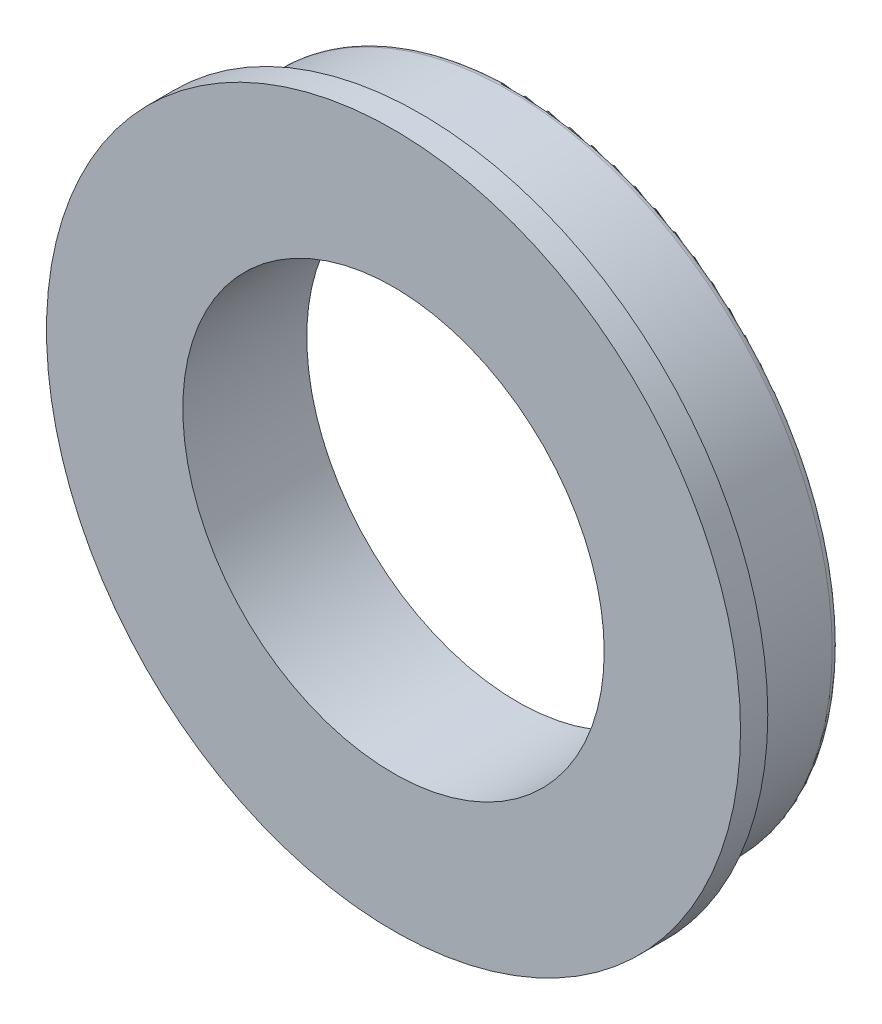
ISO-10303-21;
HEADER;
FILE_DESCRIPTION(('STEP AP214'),'2;1');
FILE_NAME('part.step','',(''),(''),'','','');
FILE_SCHEMA(('AUTOMOTIVE_DESIGN { 1 0 10303 214 1 1 1 1 }'));
ENDSEC;
DATA;
#1=APPLICATION_CONTEXT('core data for automotive mechanical design processes');
#2=APPLICATION_PROTOCOL_DEFINITION('international standard','automotive_design',2000,#1);
#3=PRODUCT_CONTEXT('',#1,'mechanical');
#4=PRODUCT('Part','Part','',(#3));
#5=PRODUCT_RELATED_PRODUCT_CATEGORY('part','',(#4));
#6=PRODUCT_DEFINITION_FORMATION('','',#4);
#7=PRODUCT_DEFINITION_CONTEXT('part definition',#1,'design');
#8=PRODUCT_DEFINITION('design','',#6,#7);
#9=PRODUCT_DEFINITION_SHAPE('','',#8);
#10=(LENGTH_UNIT() NAMED_UNIT(*) SI_UNIT(.MILLI.,.METRE.));
#11=(NAMED_UNIT(*) PLANE_ANGLE_UNIT() SI_UNIT($,.RADIAN.));
#12=(NAMED_UNIT(*) SI_UNIT($,.STERADIAN.) SOLID_ANGLE_UNIT());
#13=UNCERTAINTY_MEASURE_WITH_UNIT(LENGTH_MEASURE(1.E-05),#10,'distance_accuracy_value','');
#14=(GEOMETRIC_REPRESENTATION_CONTEXT(3) GLOBAL_UNCERTAINTY_ASSIGNED_CONTEXT((#13)) GLOBAL_UNIT_ASSIGNED_CONTEXT((#10,
#11,#12)) REPRESENTATION_CONTEXT('',''));
#15=CARTESIAN_POINT('',(0.,0.,0.));
#16=DIRECTION('',(0.,0.,1.));
#17=DIRECTION('',(1.,0.,0.));
#18=AXIS2_PLACEMENT_3D('',#15,#16,#17);
#19=CARTESIAN_POINT('',(0.,0.,5.));
#20=DIRECTION('',(0.,0.,-1.));
#21=DIRECTION('',(-1.,0.,0.));
#22=AXIS2_PLACEMENT_3D('',#19,#20,#21);
#23=CYLINDRICAL_SURFACE('',#22,13.);
#24=CARTESIAN_POINT('',(0.,0.,0.3));
#25=DIRECTION('',(0.,0.,1.));
#26=DIRECTION('',(1.,0.,0.));
#27=AXIS2_PLACEMENT_3D('',#24,#25,#26);
#28=CIRCLE('',#27,13.);
#29=CARTESIAN_POINT('',(13.,0.,0.3));
#30=VERTEX_POINT('',#29);
#31=EDGE_CURVE('E39',#30,#30,#28,.T.);
#32=ORIENTED_EDGE('',*,*,#31,.T.);
#33=EDGE_LOOP('',(#32));
#34=FACE_BOUND('',#33,.T.);
#35=CARTESIAN_POINT('',(0.,0.,3.9));
#36=DIRECTION('',(0.,0.,1.));
#37=DIRECTION('',(1.,0.,0.));
#38=AXIS2_PLACEMENT_3D('',#35,#36,#37);
#39=CIRCLE('',#38,13.);
#40=CARTESIAN_POINT('',(13.,0.,3.9));
#41=VERTEX_POINT('',#40);
#42=EDGE_CURVE('E43',#41,#41,#39,.T.);
#43=ORIENTED_EDGE('',*,*,#42,.F.);
#44=EDGE_LOOP('',(#43));
#45=FACE_BOUND('',#44,.T.);
#46=ADVANCED_FACE('F32',(#34,#45),#23,.T.);
#47=CARTESIAN_POINT('',(0.,0.,5.));
#48=DIRECTION('',(0.,0.,1.));
#49=DIRECTION('',(1.,0.,0.));
#50=AXIS2_PLACEMENT_3D('',#47,#48,#49);
#51=PLANE('',#50);
#52=CARTESIAN_POINT('',(0.,0.,5.));
#53=DIRECTION('',(0.,0.,1.));
#54=DIRECTION('',(1.,0.,0.));
#55=AXIS2_PLACEMENT_3D('',#52,#53,#54);
#56=CIRCLE('',#55,8.5);
#57=CARTESIAN_POINT('',(8.5,0.,5.));
#58=VERTEX_POINT('',#57);
#59=EDGE_CURVE('E47',#58,#58,#56,.T.);
#60=ORIENTED_EDGE('',*,*,#59,.F.);
#61=EDGE_LOOP('',(#60));
#62=FACE_BOUND('',#61,.T.);
#63=CARTESIAN_POINT('',(0.,0.,5.));
#64=DIRECTION('',(0.,0.,1.));
#65=DIRECTION('',(1.,0.,0.));
#66=AXIS2_PLACEMENT_3D('',#63,#64,#65);
#67=CIRCLE('',#66,14.);
#68=CARTESIAN_POINT('',(14.,0.,5.));
#69=VERTEX_POINT('',#68);
#70=EDGE_CURVE('E56',#69,#69,#67,.T.);
#71=ORIENTED_EDGE('',*,*,#70,.T.);
#72=EDGE_LOOP('',(#71));
#73=FACE_BOUND('',#72,.T.);
#74=ADVANCED_FACE('F77',(#62,#73),#51,.T.);
#75=CARTESIAN_POINT('',(0.,0.,0.));
#76=DIRECTION('',(0.,0.,1.));
#77=DIRECTION('',(1.,0.,0.));
#78=AXIS2_PLACEMENT_3D('',#75,#76,#77);
#79=PLANE('',#78);
#80=CARTESIAN_POINT('',(0.,0.,0.));
#81=DIRECTION('',(0.,0.,1.));
#82=DIRECTION('',(1.,0.,0.));
#83=AXIS2_PLACEMENT_3D('',#80,#81,#82);
#84=CIRCLE('',#83,12.7);
#85=CARTESIAN_POINT('',(12.7,0.,0.));
#86=VERTEX_POINT('',#85);
#87=EDGE_CURVE('E10',#86,#86,#84,.F.);
#88=ORIENTED_EDGE('',*,*,#87,.T.);
#89=EDGE_LOOP('',(#88));
#90=FACE_BOUND('',#89,.T.);
#91=CARTESIAN_POINT('',(0.,0.,0.));
#92=DIRECTION('',(0.,0.,1.));
#93=DIRECTION('',(1.,0.,0.));
#94=AXIS2_PLACEMENT_3D('',#91,#92,#93);
#95=CIRCLE('',#94,8.5);
#96=CARTESIAN_POINT('',(8.5,0.,0.));
#97=VERTEX_POINT('',#96);
#98=EDGE_CURVE('E50',#97,#97,#95,.T.);
#99=ORIENTED_EDGE('',*,*,#98,.T.);
#100=EDGE_LOOP('',(#99));
#101=FACE_BOUND('',#100,.T.);
#102=ADVANCED_FACE('F81',(#90,#101),#79,.F.);
#103=CARTESIAN_POINT('',(0.,0.,5.));
#104=DIRECTION('',(0.,0.,-1.));
#105=DIRECTION('',(-1.,0.,0.));
#106=AXIS2_PLACEMENT_3D('',#103,#104,#105);
#107=CYLINDRICAL_SURFACE('',#106,8.5);
#108=ORIENTED_EDGE('',*,*,#59,.T.);
#109=EDGE_LOOP('',(#108));
#110=FACE_BOUND('',#109,.T.);
#111=ORIENTED_EDGE('',*,*,#98,.F.);
#112=EDGE_LOOP('',(#111));
#113=FACE_BOUND('',#112,.T.);
#114=ADVANCED_FACE('F74',(#110,#113),#107,.F.);
#115=CARTESIAN_POINT('',(0.,0.,3.9));
#116=DIRECTION('',(0.,0.,1.));
#117=DIRECTION('',(1.,0.,0.));
#118=AXIS2_PLACEMENT_3D('',#115,#116,#117);
#119=CYLINDRICAL_SURFACE('',#118,14.);
#120=CARTESIAN_POINT('',(0.,0.,3.9));
#121=DIRECTION('',(0.,0.,1.));
#122=DIRECTION('',(1.,0.,0.));
#123=AXIS2_PLACEMENT_3D('',#120,#121,#122);
#124=CIRCLE('',#123,14.);
#125=CARTESIAN_POINT('',(14.,0.,3.9));
#126=VERTEX_POINT('',#125);
#127=EDGE_CURVE('E53',#126,#126,#124,.T.);
#128=ORIENTED_EDGE('',*,*,#127,.T.);
#129=EDGE_LOOP('',(#128));
#130=FACE_BOUND('',#129,.T.);
#131=ORIENTED_EDGE('',*,*,#70,.F.);
#132=EDGE_LOOP('',(#131));
#133=FACE_BOUND('',#132,.T.);
#134=ADVANCED_FACE('F62',(#130,#133),#119,.T.);
#135=CARTESIAN_POINT('',(0.,0.,3.9));
#136=DIRECTION('',(0.,0.,1.));
#137=DIRECTION('',(1.,0.,0.));
#138=AXIS2_PLACEMENT_3D('',#135,#136,#137);
#139=PLANE('',#138);
#140=ORIENTED_EDGE('',*,*,#42,.T.);
#141=EDGE_LOOP('',(#140));
#142=FACE_BOUND('',#141,.T.);
#143=ORIENTED_EDGE('',*,*,#127,.F.);
#144=EDGE_LOOP('',(#143));
#145=FACE_BOUND('',#144,.T.);
#146=ADVANCED_FACE('F65',(#142,#145),#139,.F.);
#147=CARTESIAN_POINT('',(0.,0.,0.3));
#148=DIRECTION('',(0.,0.,1.));
#149=DIRECTION('',(1.,0.,0.));
#150=AXIS2_PLACEMENT_3D('',#147,#148,#149);
#151=TOROIDAL_SURFACE('',#150,12.7,0.3);
#152=ORIENTED_EDGE('',*,*,#87,.F.);
#153=EDGE_LOOP('',(#152));
#154=FACE_BOUND('',#153,.T.);
#155=ORIENTED_EDGE('',*,*,#31,.F.);
#156=EDGE_LOOP('',(#155));
#157=FACE_BOUND('',#156,.T.);
#158=ADVANCED_FACE('F34',(#154,#157),#151,.T.);
#159=CLOSED_SHELL('',(#46,#74,#102,#114,#134,#146,#158));
#160=MANIFOLD_SOLID_BREP('B2',#159);
#161=ADVANCED_BREP_SHAPE_REPRESENTATION('',(#18,#160),#14);
#162=SHAPE_DEFINITION_REPRESENTATION(#9,#161);
ENDSEC;
END-ISO-10303-21;
